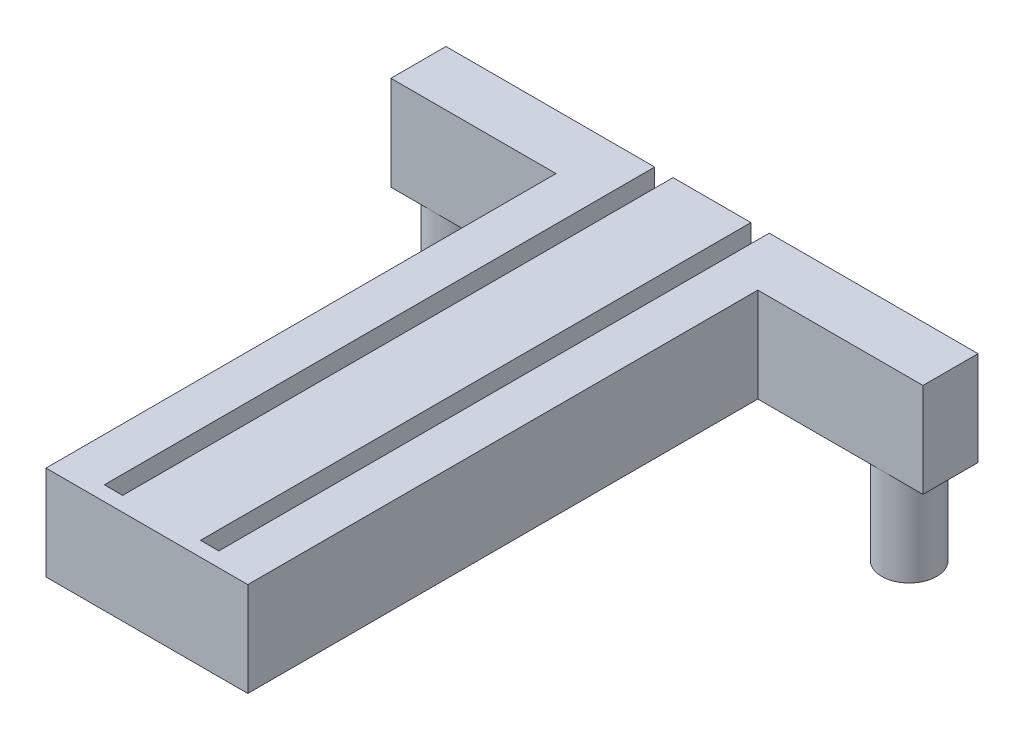
ISO-10303-21;
HEADER;
FILE_DESCRIPTION(('STEP AP214'),'2;1');
FILE_NAME('part.step','',(''),(''),'','','');
FILE_SCHEMA(('AUTOMOTIVE_DESIGN { 1 0 10303 214 1 1 1 1 }'));
ENDSEC;
DATA;
#1=APPLICATION_CONTEXT('core data for automotive mechanical design processes');
#2=APPLICATION_PROTOCOL_DEFINITION('international standard','automotive_design',2000,#1);
#3=PRODUCT_CONTEXT('',#1,'mechanical');
#4=PRODUCT('Part','Part','',(#3));
#5=PRODUCT_RELATED_PRODUCT_CATEGORY('part','',(#4));
#6=PRODUCT_DEFINITION_FORMATION('','',#4);
#7=PRODUCT_DEFINITION_CONTEXT('part definition',#1,'design');
#8=PRODUCT_DEFINITION('design','',#6,#7);
#9=PRODUCT_DEFINITION_SHAPE('','',#8);
#10=(LENGTH_UNIT() NAMED_UNIT(*) SI_UNIT(.MILLI.,.METRE.));
#11=(NAMED_UNIT(*) PLANE_ANGLE_UNIT() SI_UNIT($,.RADIAN.));
#12=(NAMED_UNIT(*) SI_UNIT($,.STERADIAN.) SOLID_ANGLE_UNIT());
#13=UNCERTAINTY_MEASURE_WITH_UNIT(LENGTH_MEASURE(1.E-05),#10,'distance_accuracy_value','');
#14=(GEOMETRIC_REPRESENTATION_CONTEXT(3) GLOBAL_UNCERTAINTY_ASSIGNED_CONTEXT((#13)) GLOBAL_UNIT_ASSIGNED_CONTEXT((#10,
#11,#12)) REPRESENTATION_CONTEXT('',''));
#15=CARTESIAN_POINT('',(0.,0.,0.));
#16=DIRECTION('',(0.,0.,1.));
#17=DIRECTION('',(1.,0.,0.));
#18=AXIS2_PLACEMENT_3D('',#15,#16,#17);
#19=CARTESIAN_POINT('',(31.75,-2.59150528660835,76.2));
#20=DIRECTION('',(0.,1.,0.));
#21=DIRECTION('',(0.,0.,1.));
#22=AXIS2_PLACEMENT_3D('',#19,#20,#21);
#23=PLANE('',#22);
#24=CARTESIAN_POINT('',(31.115,-2.59150528660835,3.81));
#25=DIRECTION('',(0.,-1.,0.));
#26=DIRECTION('',(0.,0.,-1.));
#27=AXIS2_PLACEMENT_3D('',#24,#25,#26);
#28=CIRCLE('',#27,3.81);
#29=CARTESIAN_POINT('',(31.115,-2.59150528660835,7.62));
#30=VERTEX_POINT('',#29);
#31=CARTESIAN_POINT('',(31.115,-2.59150528660835,0.));
#32=VERTEX_POINT('',#31);
#33=EDGE_CURVE('E609',#30,#32,#28,.T.);
#34=ORIENTED_EDGE('',*,*,#33,.F.);
#35=DIRECTION('',(-1.,0.,0.));
#36=VECTOR('',#35,1.);
#37=CARTESIAN_POINT('',(31.75,-2.59150528660835,7.62000000000002));
#38=LINE('',#37,#36);
#39=CARTESIAN_POINT('',(13.97,-2.59150528660837,7.62));
#40=VERTEX_POINT('',#39);
#41=EDGE_CURVE('E456',#30,#40,#38,.T.);
#42=ORIENTED_EDGE('',*,*,#41,.T.);
#43=DIRECTION('',(0.,0.,1.));
#44=VECTOR('',#43,1.);
#45=CARTESIAN_POINT('',(13.97,-2.59150528660835,76.2));
#46=LINE('',#45,#44);
#47=CARTESIAN_POINT('',(13.97,-2.59150528660837,78.232));
#48=VERTEX_POINT('',#47);
#49=EDGE_CURVE('E461',#40,#48,#46,.T.);
#50=ORIENTED_EDGE('',*,*,#49,.T.);
#51=DIRECTION('',(1.,0.,0.));
#52=VECTOR('',#51,1.);
#53=CARTESIAN_POINT('',(-13.97,-2.59150528660837,78.232));
#54=LINE('',#53,#52);
#55=CARTESIAN_POINT('',(-13.97,-2.59150528660837,78.232));
#56=VERTEX_POINT('',#55);
#57=EDGE_CURVE('E590',#56,#48,#54,.T.);
#58=ORIENTED_EDGE('',*,*,#57,.F.);
#59=DIRECTION('',(0.,0.,-1.));
#60=VECTOR('',#59,1.);
#61=CARTESIAN_POINT('',(-13.97,-2.59150528660835,76.2));
#62=LINE('',#61,#60);
#63=CARTESIAN_POINT('',(-13.97,-2.59150528660837,7.62));
#64=VERTEX_POINT('',#63);
#65=EDGE_CURVE('E457',#56,#64,#62,.T.);
#66=ORIENTED_EDGE('',*,*,#65,.T.);
#67=DIRECTION('',(-1.,0.,0.));
#68=VECTOR('',#67,1.);
#69=CARTESIAN_POINT('',(31.75,-2.59150528660835,7.62000000000002));
#70=LINE('',#69,#68);
#71=CARTESIAN_POINT('',(-31.115,-2.59150528660835,7.62000000000002));
#72=VERTEX_POINT('',#71);
#73=EDGE_CURVE('E287',#64,#72,#70,.T.);
#74=ORIENTED_EDGE('',*,*,#73,.T.);
#75=CARTESIAN_POINT('',(-31.115,-2.59150528660835,3.81));
#76=DIRECTION('',(0.,-1.,0.));
#77=DIRECTION('',(0.,0.,-1.));
#78=AXIS2_PLACEMENT_3D('',#75,#76,#77);
#79=CIRCLE('',#78,3.81);
#80=CARTESIAN_POINT('',(-31.115,-2.59150528660835,0.));
#81=VERTEX_POINT('',#80);
#82=EDGE_CURVE('E597',#81,#72,#79,.T.);
#83=ORIENTED_EDGE('',*,*,#82,.F.);
#84=DIRECTION('',(1.,0.,0.));
#85=VECTOR('',#84,1.);
#86=CARTESIAN_POINT('',(31.75,-2.59150528660835,0.));
#87=LINE('',#86,#85);
#88=CARTESIAN_POINT('',(0.,-2.59150528660837,0.));
#89=VERTEX_POINT('',#88);
#90=EDGE_CURVE('E386',#81,#89,#87,.T.);
#91=ORIENTED_EDGE('',*,*,#90,.T.);
#92=DIRECTION('',(0.,0.,1.));
#93=VECTOR('',#92,1.);
#94=CARTESIAN_POINT('',(0.,-2.59150528660837,-22.86));
#95=LINE('',#94,#93);
#96=CARTESIAN_POINT('',(0.,-2.59150528660837,76.962));
#97=VERTEX_POINT('',#96);
#98=EDGE_CURVE('E532',#89,#97,#95,.T.);
#99=ORIENTED_EDGE('',*,*,#98,.T.);
#100=DIRECTION('',(1.,0.,0.));
#101=VECTOR('',#100,1.);
#102=CARTESIAN_POINT('',(-13.97,-2.59150528660837,76.962));
#103=LINE('',#102,#101);
#104=CARTESIAN_POINT('',(1.32900114555891,-2.59150528660837,76.962));
#105=VERTEX_POINT('',#104);
#106=EDGE_CURVE('E577',#97,#105,#103,.T.);
#107=ORIENTED_EDGE('',*,*,#106,.T.);
#108=DIRECTION('',(0.,0.,1.));
#109=VECTOR('',#108,1.);
#110=CARTESIAN_POINT('',(1.32900114555892,-2.59150528660837,-22.86));
#111=LINE('',#110,#109);
#112=CARTESIAN_POINT('',(1.32900114555892,-2.59150528660837,0.));
#113=VERTEX_POINT('',#112);
#114=EDGE_CURVE('E533',#113,#105,#111,.T.);
#115=ORIENTED_EDGE('',*,*,#114,.F.);
#116=EDGE_CURVE('E388',#113,#32,#87,.T.);
#117=ORIENTED_EDGE('',*,*,#116,.T.);
#118=EDGE_LOOP('',(#34,#42,#50,#58,#66,#74,#83,#91,#99,#107,#115,#117));
#119=FACE_BOUND('',#118,.T.);
#120=ADVANCED_FACE('F40',(#119),#23,.F.);
#121=EDGE_CURVE('E605',#32,#30,#28,.T.);
#122=ORIENTED_EDGE('',*,*,#121,.F.);
#123=CARTESIAN_POINT('',(36.83,-2.59150528660835,0.));
#124=VERTEX_POINT('',#123);
#125=EDGE_CURVE('E387',#32,#124,#87,.T.);
#126=ORIENTED_EDGE('',*,*,#125,.T.);
#127=DIRECTION('',(0.,0.,-1.));
#128=VECTOR('',#127,1.);
#129=CARTESIAN_POINT('',(36.83,-2.59150528660835,76.2));
#130=LINE('',#129,#128);
#131=CARTESIAN_POINT('',(36.83,-2.59150528660837,7.62));
#132=VERTEX_POINT('',#131);
#133=EDGE_CURVE('E318',#132,#124,#130,.T.);
#134=ORIENTED_EDGE('',*,*,#133,.F.);
#135=EDGE_CURVE('E414',#132,#30,#38,.T.);
#136=ORIENTED_EDGE('',*,*,#135,.T.);
#137=EDGE_LOOP('',(#122,#126,#134,#136));
#138=FACE_BOUND('',#137,.T.);
#139=ADVANCED_FACE('F650',(#138),#23,.F.);
#140=CARTESIAN_POINT('',(1.79605122421383,1.79605122421383,76.2));
#141=DIRECTION('',(-1.,0.,0.));
#142=DIRECTION('',(0.,0.,1.));
#143=AXIS2_PLACEMENT_3D('',#140,#141,#142);
#144=PLANE('',#143);
#145=DIRECTION('',(0.,1.,0.));
#146=VECTOR('',#145,1.);
#147=CARTESIAN_POINT('',(1.79605122421383,1.79605122421383,76.2));
#148=LINE('',#147,#146);
#149=CARTESIAN_POINT('',(1.79605122421383,1.49263776173654,76.2));
#150=VERTEX_POINT('',#149);
#151=CARTESIAN_POINT('',(1.79605122421383,1.79605122421383,76.2));
#152=VERTEX_POINT('',#151);
#153=EDGE_CURVE('E426',#150,#152,#148,.T.);
#154=ORIENTED_EDGE('',*,*,#153,.F.);
#155=DIRECTION('',(0.,0.,-1.));
#156=VECTOR('',#155,1.);
#157=CARTESIAN_POINT('',(1.79605122421383,1.49263776173654,76.2));
#158=LINE('',#157,#156);
#159=CARTESIAN_POINT('',(1.79605122421383,1.49263776173654,0.));
#160=VERTEX_POINT('',#159);
#161=EDGE_CURVE('E504',#150,#160,#158,.T.);
#162=ORIENTED_EDGE('',*,*,#161,.T.);
#163=DIRECTION('',(0.,1.,0.));
#164=VECTOR('',#163,1.);
#165=CARTESIAN_POINT('',(1.79605122421383,1.79605122421383,0.));
#166=LINE('',#165,#164);
#167=CARTESIAN_POINT('',(1.79605122421383,1.79605122421383,0.));
#168=VERTEX_POINT('',#167);
#169=EDGE_CURVE('E368',#160,#168,#166,.T.);
#170=ORIENTED_EDGE('',*,*,#169,.T.);
#171=DIRECTION('',(0.,0.,-1.));
#172=VECTOR('',#171,1.);
#173=CARTESIAN_POINT('',(1.79605122421383,1.79605122421383,76.2));
#174=LINE('',#173,#172);
#175=EDGE_CURVE('E337',#152,#168,#174,.T.);
#176=ORIENTED_EDGE('',*,*,#175,.F.);
#177=EDGE_LOOP('',(#154,#162,#170,#176));
#178=FACE_BOUND('',#177,.T.);
#179=ADVANCED_FACE('F658',(#178),#144,.F.);
#180=CARTESIAN_POINT('',(0.,0.,0.));
#181=DIRECTION('',(0.,0.,1.));
#182=DIRECTION('',(1.,0.,0.));
#183=AXIS2_PLACEMENT_3D('',#180,#181,#182);
#184=PLANE('',#183);
#185=DIRECTION('',(-1.,0.,0.));
#186=VECTOR('',#185,1.);
#187=CARTESIAN_POINT('',(0.,1.49263776173654,0.));
#188=LINE('',#187,#186);
#189=CARTESIAN_POINT('',(0.,1.49263776173654,0.));
#190=VERTEX_POINT('',#189);
#191=EDGE_CURVE('E500',#160,#190,#188,.T.);
#192=ORIENTED_EDGE('',*,*,#191,.T.);
#193=DIRECTION('',(0.,-1.,0.));
#194=VECTOR('',#193,1.);
#195=CARTESIAN_POINT('',(0.,0.,0.));
#196=LINE('',#195,#194);
#197=EDGE_CURVE('E496',#190,#89,#196,.T.);
#198=ORIENTED_EDGE('',*,*,#197,.T.);
#199=ORIENTED_EDGE('',*,*,#90,.F.);
#200=CARTESIAN_POINT('',(-36.83,-2.59150528660835,0.));
#201=VERTEX_POINT('',#200);
#202=EDGE_CURVE('E383',#201,#81,#87,.T.);
#203=ORIENTED_EDGE('',*,*,#202,.F.);
#204=DIRECTION('',(0.,-1.,0.));
#205=VECTOR('',#204,1.);
#206=CARTESIAN_POINT('',(-36.83,10.4681536726415,0.));
#207=LINE('',#206,#205);
#208=CARTESIAN_POINT('',(-36.83,10.4681536726415,0.));
#209=VERTEX_POINT('',#208);
#210=EDGE_CURVE('E389',#209,#201,#207,.T.);
#211=ORIENTED_EDGE('',*,*,#210,.F.);
#212=DIRECTION('',(-1.,0.,0.));
#213=VECTOR('',#212,1.);
#214=CARTESIAN_POINT('',(-31.75,10.4681536726415,0.));
#215=LINE('',#214,#213);
#216=CARTESIAN_POINT('',(-7.92815367264149,10.4681536726415,0.));
#217=VERTEX_POINT('',#216);
#218=EDGE_CURVE('E393',#217,#209,#215,.T.);
#219=ORIENTED_EDGE('',*,*,#218,.F.);
#220=DIRECTION('',(0.,1.,0.));
#221=VECTOR('',#220,1.);
#222=CARTESIAN_POINT('',(-7.92815367264149,10.4681536726415,0.));
#223=LINE('',#222,#221);
#224=CARTESIAN_POINT('',(-7.92815367264149,0.,0.));
#225=VERTEX_POINT('',#224);
#226=EDGE_CURVE('E397',#225,#217,#223,.T.);
#227=ORIENTED_EDGE('',*,*,#226,.F.);
#228=DIRECTION('',(-1.,0.,0.));
#229=VECTOR('',#228,1.);
#230=CARTESIAN_POINT('',(-7.92815367264149,0.,0.));
#231=LINE('',#230,#229);
#232=CARTESIAN_POINT('',(-1.79605122421383,0.,0.));
#233=VERTEX_POINT('',#232);
#234=EDGE_CURVE('E401',#233,#225,#231,.T.);
#235=ORIENTED_EDGE('',*,*,#234,.F.);
#236=DIRECTION('',(0.,-1.,0.));
#237=VECTOR('',#236,1.);
#238=CARTESIAN_POINT('',(-1.79605122421383,1.79605122421383,0.));
#239=LINE('',#238,#237);
#240=CARTESIAN_POINT('',(-1.79605122421383,1.79605122421383,0.));
#241=VERTEX_POINT('',#240);
#242=EDGE_CURVE('E404',#241,#233,#239,.T.);
#243=ORIENTED_EDGE('',*,*,#242,.F.);
#244=DIRECTION('',(0.707106781186553,-0.707106781186542,0.));
#245=VECTOR('',#244,1.);
#246=CARTESIAN_POINT('',(-1.79605122421383,1.79605122421383,0.));
#247=LINE('',#246,#245);
#248=CARTESIAN_POINT('',(-5.38815367264152,5.38815367264147,0.));
#249=VERTEX_POINT('',#248);
#250=EDGE_CURVE('E407',#249,#241,#247,.T.);
#251=ORIENTED_EDGE('',*,*,#250,.F.);
#252=DIRECTION('',(0.,-1.,0.));
#253=VECTOR('',#252,1.);
#254=CARTESIAN_POINT('',(-5.38815367264152,5.38815367264147,0.));
#255=LINE('',#254,#253);
#256=CARTESIAN_POINT('',(-5.38815367264149,10.4681536726415,0.));
#257=VERTEX_POINT('',#256);
#258=EDGE_CURVE('E410',#257,#249,#255,.T.);
#259=ORIENTED_EDGE('',*,*,#258,.F.);
#260=DIRECTION('',(-1.,0.,0.));
#261=VECTOR('',#260,1.);
#262=CARTESIAN_POINT('',(5.38815367264141,10.4681536726415,0.));
#263=LINE('',#262,#261);
#264=CARTESIAN_POINT('',(5.38815367264141,10.4681536726415,0.));
#265=VERTEX_POINT('',#264);
#266=EDGE_CURVE('E354',#265,#257,#263,.T.);
#267=ORIENTED_EDGE('',*,*,#266,.F.);
#268=DIRECTION('',(0.,1.,0.));
#269=VECTOR('',#268,1.);
#270=CARTESIAN_POINT('',(5.38815367264141,5.38815367264147,0.));
#271=LINE('',#270,#269);
#272=CARTESIAN_POINT('',(5.38815367264141,5.38815367264147,0.));
#273=VERTEX_POINT('',#272);
#274=EDGE_CURVE('E358',#273,#265,#271,.T.);
#275=ORIENTED_EDGE('',*,*,#274,.F.);
#276=DIRECTION('',(0.707106781186542,0.707106781186553,0.));
#277=VECTOR('',#276,1.);
#278=CARTESIAN_POINT('',(1.79605122421383,1.79605122421383,0.));
#279=LINE('',#278,#277);
#280=EDGE_CURVE('E361',#168,#273,#279,.T.);
#281=ORIENTED_EDGE('',*,*,#280,.F.);
#282=ORIENTED_EDGE('',*,*,#169,.F.);
#283=EDGE_LOOP('',(#192,#198,#199,#203,#211,#219,#227,#235,#243,#251,#259,#267,#275,#281,#282));
#284=FACE_BOUND('',#283,.T.);
#285=ADVANCED_FACE('F754',(#284),#184,.F.);
#286=CARTESIAN_POINT('',(-5.38815367264152,5.38815367264147,76.2));
#287=DIRECTION('',(1.,0.,0.));
#288=DIRECTION('',(0.,1.,0.));
#289=AXIS2_PLACEMENT_3D('',#286,#287,#288);
#290=PLANE('',#289);
#291=ORIENTED_EDGE('',*,*,#258,.T.);
#292=DIRECTION('',(0.,0.,-1.));
#293=VECTOR('',#292,1.);
#294=CARTESIAN_POINT('',(-5.38815367264152,5.38815367264147,76.2));
#295=LINE('',#294,#293);
#296=CARTESIAN_POINT('',(-5.38815367264152,5.38815367264147,76.2));
#297=VERTEX_POINT('',#296);
#298=EDGE_CURVE('E292',#297,#249,#295,.T.);
#299=ORIENTED_EDGE('',*,*,#298,.F.);
#300=DIRECTION('',(0.,-1.,0.));
#301=VECTOR('',#300,1.);
#302=CARTESIAN_POINT('',(-5.38815367264152,5.38815367264147,76.2));
#303=LINE('',#302,#301);
#304=CARTESIAN_POINT('',(-5.38815367264149,10.4681536726415,76.2));
#305=VERTEX_POINT('',#304);
#306=EDGE_CURVE('E357',#305,#297,#303,.T.);
#307=ORIENTED_EDGE('',*,*,#306,.F.);
#308=DIRECTION('',(0.,0.,-1.));
#309=VECTOR('',#308,1.);
#310=CARTESIAN_POINT('',(-5.38815367264149,10.4681536726415,76.2));
#311=LINE('',#310,#309);
#312=EDGE_CURVE('E349',#305,#257,#311,.T.);
#313=ORIENTED_EDGE('',*,*,#312,.T.);
#314=EDGE_LOOP('',(#291,#299,#307,#313));
#315=FACE_BOUND('',#314,.T.);
#316=ADVANCED_FACE('F42',(#315),#290,.F.);
#317=CARTESIAN_POINT('',(-1.79605122421383,1.79605122421383,76.2));
#318=DIRECTION('',(0.707106781186542,0.707106781186553,0.));
#319=DIRECTION('',(-0.707106781186553,0.707106781186542,0.));
#320=AXIS2_PLACEMENT_3D('',#317,#318,#319);
#321=PLANE('',#320);
#322=ORIENTED_EDGE('',*,*,#250,.T.);
#323=DIRECTION('',(0.,0.,-1.));
#324=VECTOR('',#323,1.);
#325=CARTESIAN_POINT('',(-1.79605122421383,1.79605122421383,76.2));
#326=LINE('',#325,#324);
#327=CARTESIAN_POINT('',(-1.79605122421383,1.79605122421383,76.2));
#328=VERTEX_POINT('',#327);
#329=EDGE_CURVE('E296',#328,#241,#326,.T.);
#330=ORIENTED_EDGE('',*,*,#329,.F.);
#331=DIRECTION('',(0.707106781186553,-0.707106781186542,0.));
#332=VECTOR('',#331,1.);
#333=CARTESIAN_POINT('',(-1.79605122421383,1.79605122421383,76.2));
#334=LINE('',#333,#332);
#335=EDGE_CURVE('E447',#297,#328,#334,.T.);
#336=ORIENTED_EDGE('',*,*,#335,.F.);
#337=ORIENTED_EDGE('',*,*,#298,.T.);
#338=EDGE_LOOP('',(#322,#330,#336,#337));
#339=FACE_BOUND('',#338,.T.);
#340=ADVANCED_FACE('F838',(#339),#321,.F.);
#341=CARTESIAN_POINT('',(-1.79605122421383,1.79605122421383,76.2));
#342=DIRECTION('',(1.,0.,0.));
#343=DIRECTION('',(0.,1.,0.));
#344=AXIS2_PLACEMENT_3D('',#341,#342,#343);
#345=PLANE('',#344);
#346=ORIENTED_EDGE('',*,*,#242,.T.);
#347=DIRECTION('',(0.,0.,-1.));
#348=VECTOR('',#347,1.);
#349=CARTESIAN_POINT('',(-1.79605122421383,0.,76.2));
#350=LINE('',#349,#348);
#351=CARTESIAN_POINT('',(-1.79605122421383,0.,76.2));
#352=VERTEX_POINT('',#351);
#353=EDGE_CURVE('E300',#352,#233,#350,.T.);
#354=ORIENTED_EDGE('',*,*,#353,.F.);
#355=DIRECTION('',(0.,-1.,0.));
#356=VECTOR('',#355,1.);
#357=CARTESIAN_POINT('',(-1.79605122421383,1.79605122421383,76.2));
#358=LINE('',#357,#356);
#359=EDGE_CURVE('E443',#328,#352,#358,.T.);
#360=ORIENTED_EDGE('',*,*,#359,.F.);
#361=ORIENTED_EDGE('',*,*,#329,.T.);
#362=EDGE_LOOP('',(#346,#354,#360,#361));
#363=FACE_BOUND('',#362,.T.);
#364=ADVANCED_FACE('F847',(#363),#345,.F.);
#365=CARTESIAN_POINT('',(-7.92815367264149,0.,76.2));
#366=DIRECTION('',(0.,-1.,0.));
#367=DIRECTION('',(0.,0.,-1.));
#368=AXIS2_PLACEMENT_3D('',#365,#366,#367);
#369=PLANE('',#368);
#370=ORIENTED_EDGE('',*,*,#234,.T.);
#371=DIRECTION('',(0.,0.,-1.));
#372=VECTOR('',#371,1.);
#373=CARTESIAN_POINT('',(-7.92815367264149,0.,76.2));
#374=LINE('',#373,#372);
#375=CARTESIAN_POINT('',(-7.92815367264149,0.,76.2));
#376=VERTEX_POINT('',#375);
#377=EDGE_CURVE('E304',#376,#225,#374,.T.);
#378=ORIENTED_EDGE('',*,*,#377,.F.);
#379=DIRECTION('',(-1.,0.,0.));
#380=VECTOR('',#379,1.);
#381=CARTESIAN_POINT('',(-7.92815367264149,0.,76.2));
#382=LINE('',#381,#380);
#383=EDGE_CURVE('E439',#352,#376,#382,.T.);
#384=ORIENTED_EDGE('',*,*,#383,.F.);
#385=ORIENTED_EDGE('',*,*,#353,.T.);
#386=EDGE_LOOP('',(#370,#378,#384,#385));
#387=FACE_BOUND('',#386,.T.);
#388=ADVANCED_FACE('F844',(#387),#369,.F.);
#389=CARTESIAN_POINT('',(-7.92815367264149,10.4681536726415,76.2));
#390=DIRECTION('',(-1.,0.,0.));
#391=DIRECTION('',(0.,0.,1.));
#392=AXIS2_PLACEMENT_3D('',#389,#390,#391);
#393=PLANE('',#392);
#394=ORIENTED_EDGE('',*,*,#226,.T.);
#395=DIRECTION('',(0.,0.,-1.));
#396=VECTOR('',#395,1.);
#397=CARTESIAN_POINT('',(-7.92815367264149,10.4681536726415,76.2));
#398=LINE('',#397,#396);
#399=CARTESIAN_POINT('',(-7.92815367264149,10.4681536726415,76.2));
#400=VERTEX_POINT('',#399);
#401=EDGE_CURVE('E308',#400,#217,#398,.T.);
#402=ORIENTED_EDGE('',*,*,#401,.F.);
#403=DIRECTION('',(0.,1.,0.));
#404=VECTOR('',#403,1.);
#405=CARTESIAN_POINT('',(-7.92815367264149,10.4681536726415,76.2));
#406=LINE('',#405,#404);
#407=EDGE_CURVE('E435',#376,#400,#406,.T.);
#408=ORIENTED_EDGE('',*,*,#407,.F.);
#409=ORIENTED_EDGE('',*,*,#377,.T.);
#410=EDGE_LOOP('',(#394,#402,#408,#409));
#411=FACE_BOUND('',#410,.T.);
#412=ADVANCED_FACE('F674',(#411),#393,.F.);
#413=CARTESIAN_POINT('',(-36.83,10.4681536726415,76.2));
#414=DIRECTION('',(1.,0.,0.));
#415=DIRECTION('',(0.,0.,-1.));
#416=AXIS2_PLACEMENT_3D('',#413,#414,#415);
#417=PLANE('',#416);
#418=DIRECTION('',(0.,0.,-1.));
#419=VECTOR('',#418,1.);
#420=CARTESIAN_POINT('',(-36.83,-2.59150528660835,76.2));
#421=LINE('',#420,#419);
#422=CARTESIAN_POINT('',(-36.83,-2.59150528660837,7.62));
#423=VERTEX_POINT('',#422);
#424=EDGE_CURVE('E315',#423,#201,#421,.T.);
#425=ORIENTED_EDGE('',*,*,#424,.F.);
#426=DIRECTION('',(0.,1.,0.));
#427=VECTOR('',#426,1.);
#428=CARTESIAN_POINT('',(-36.83,-65.7318463273585,7.62));
#429=LINE('',#428,#427);
#430=CARTESIAN_POINT('',(-36.83,10.4681536726415,7.62));
#431=VERTEX_POINT('',#430);
#432=EDGE_CURVE('E464',#423,#431,#429,.T.);
#433=ORIENTED_EDGE('',*,*,#432,.T.);
#434=DIRECTION('',(0.,0.,-1.));
#435=VECTOR('',#434,1.);
#436=CARTESIAN_POINT('',(-36.83,10.4681536726415,76.2));
#437=LINE('',#436,#435);
#438=EDGE_CURVE('E312',#431,#209,#437,.T.);
#439=ORIENTED_EDGE('',*,*,#438,.T.);
#440=ORIENTED_EDGE('',*,*,#210,.T.);
#441=EDGE_LOOP('',(#425,#433,#439,#440));
#442=FACE_BOUND('',#441,.T.);
#443=ADVANCED_FACE('F665',(#442),#417,.F.);
#444=EDGE_CURVE('E286',#72,#81,#79,.T.);
#445=ORIENTED_EDGE('',*,*,#444,.F.);
#446=EDGE_CURVE('E291',#72,#423,#70,.T.);
#447=ORIENTED_EDGE('',*,*,#446,.T.);
#448=ORIENTED_EDGE('',*,*,#424,.T.);
#449=ORIENTED_EDGE('',*,*,#202,.T.);
#450=EDGE_LOOP('',(#445,#447,#448,#449));
#451=FACE_BOUND('',#450,.T.);
#452=ADVANCED_FACE('F653',(#451),#23,.F.);
#453=CARTESIAN_POINT('',(36.83,-2.59150528660835,76.2));
#454=DIRECTION('',(-1.,0.,0.));
#455=DIRECTION('',(0.,0.,1.));
#456=AXIS2_PLACEMENT_3D('',#453,#454,#455);
#457=PLANE('',#456);
#458=DIRECTION('',(0.,0.,-1.));
#459=VECTOR('',#458,1.);
#460=CARTESIAN_POINT('',(36.83,10.4681536726415,76.2));
#461=LINE('',#460,#459);
#462=CARTESIAN_POINT('',(36.83,10.4681536726415,7.62));
#463=VERTEX_POINT('',#462);
#464=CARTESIAN_POINT('',(36.83,10.4681536726415,0.));
#465=VERTEX_POINT('',#464);
#466=EDGE_CURVE('E322',#463,#465,#461,.T.);
#467=ORIENTED_EDGE('',*,*,#466,.F.);
#468=DIRECTION('',(0.,1.,0.));
#469=VECTOR('',#468,1.);
#470=CARTESIAN_POINT('',(36.83,-65.7318463273585,7.62));
#471=LINE('',#470,#469);
#472=EDGE_CURVE('E465',#132,#463,#471,.T.);
#473=ORIENTED_EDGE('',*,*,#472,.F.);
#474=ORIENTED_EDGE('',*,*,#133,.T.);
#475=DIRECTION('',(0.,1.,0.));
#476=VECTOR('',#475,1.);
#477=CARTESIAN_POINT('',(36.83,-2.59150528660835,0.));
#478=LINE('',#477,#476);
#479=EDGE_CURVE('E379',#124,#465,#478,.T.);
#480=ORIENTED_EDGE('',*,*,#479,.T.);
#481=EDGE_LOOP('',(#467,#473,#474,#480));
#482=FACE_BOUND('',#481,.T.);
#483=ADVANCED_FACE('F664',(#482),#457,.F.);
#484=CARTESIAN_POINT('',(7.92815367264141,0.,76.2));
#485=DIRECTION('',(1.,0.,0.));
#486=DIRECTION('',(0.,0.,-1.));
#487=AXIS2_PLACEMENT_3D('',#484,#485,#486);
#488=PLANE('',#487);
#489=DIRECTION('',(0.,-1.,0.));
#490=VECTOR('',#489,1.);
#491=CARTESIAN_POINT('',(7.92815367264141,0.,0.));
#492=LINE('',#491,#490);
#493=CARTESIAN_POINT('',(7.92815367264141,10.4681536726415,0.));
#494=VERTEX_POINT('',#493);
#495=CARTESIAN_POINT('',(7.92815367264141,0.,0.));
#496=VERTEX_POINT('',#495);
#497=EDGE_CURVE('E372',#494,#496,#492,.T.);
#498=ORIENTED_EDGE('',*,*,#497,.T.);
#499=DIRECTION('',(0.,0.,-1.));
#500=VECTOR('',#499,1.);
#501=CARTESIAN_POINT('',(7.92815367264141,0.,76.2));
#502=LINE('',#501,#500);
#503=CARTESIAN_POINT('',(7.92815367264141,0.,76.2));
#504=VERTEX_POINT('',#503);
#505=EDGE_CURVE('E329',#504,#496,#502,.T.);
#506=ORIENTED_EDGE('',*,*,#505,.F.);
#507=DIRECTION('',(0.,-1.,0.));
#508=VECTOR('',#507,1.);
#509=CARTESIAN_POINT('',(7.92815367264141,0.,76.2));
#510=LINE('',#509,#508);
#511=CARTESIAN_POINT('',(7.92815367264141,10.4681536726415,76.2));
#512=VERTEX_POINT('',#511);
#513=EDGE_CURVE('E431',#512,#504,#510,.T.);
#514=ORIENTED_EDGE('',*,*,#513,.F.);
#515=DIRECTION('',(0.,0.,-1.));
#516=VECTOR('',#515,1.);
#517=CARTESIAN_POINT('',(7.92815367264141,10.4681536726415,76.2));
#518=LINE('',#517,#516);
#519=EDGE_CURVE('E325',#512,#494,#518,.T.);
#520=ORIENTED_EDGE('',*,*,#519,.T.);
#521=EDGE_LOOP('',(#498,#506,#514,#520));
#522=FACE_BOUND('',#521,.T.);
#523=ADVANCED_FACE('F671',(#522),#488,.F.);
#524=CARTESIAN_POINT('',(1.79605122421383,0.,76.2));
#525=DIRECTION('',(0.,-1.,0.));
#526=DIRECTION('',(0.,0.,-1.));
#527=AXIS2_PLACEMENT_3D('',#524,#525,#526);
#528=PLANE('',#527);
#529=DIRECTION('',(-1.,0.,0.));
#530=VECTOR('',#529,1.);
#531=CARTESIAN_POINT('',(1.79605122421383,0.,0.));
#532=LINE('',#531,#530);
#533=CARTESIAN_POINT('',(1.79605122421383,0.,0.));
#534=VERTEX_POINT('',#533);
#535=EDGE_CURVE('E369',#496,#534,#532,.T.);
#536=ORIENTED_EDGE('',*,*,#535,.T.);
#537=DIRECTION('',(0.,0.,-1.));
#538=VECTOR('',#537,1.);
#539=CARTESIAN_POINT('',(1.79605122421383,0.,76.2));
#540=LINE('',#539,#538);
#541=CARTESIAN_POINT('',(1.79605122421383,0.,76.2));
#542=VERTEX_POINT('',#541);
#543=EDGE_CURVE('E333',#542,#534,#540,.T.);
#544=ORIENTED_EDGE('',*,*,#543,.F.);
#545=DIRECTION('',(-1.,0.,0.));
#546=VECTOR('',#545,1.);
#547=CARTESIAN_POINT('',(5.38815367264141,0.,76.2));
#548=LINE('',#547,#546);
#549=EDGE_CURVE('E427',#504,#542,#548,.T.);
#550=ORIENTED_EDGE('',*,*,#549,.F.);
#551=ORIENTED_EDGE('',*,*,#505,.T.);
#552=EDGE_LOOP('',(#536,#544,#550,#551));
#553=FACE_BOUND('',#552,.T.);
#554=ADVANCED_FACE('F768',(#553),#528,.F.);
#555=CARTESIAN_POINT('',(1.79605122421383,0.714117771054303,0.));
#556=VERTEX_POINT('',#555);
#557=EDGE_CURVE('E364',#534,#556,#166,.T.);
#558=ORIENTED_EDGE('',*,*,#557,.T.);
#559=DIRECTION('',(0.,0.,1.));
#560=VECTOR('',#559,1.);
#561=CARTESIAN_POINT('',(1.79605122421383,0.714117771054303,76.2));
#562=LINE('',#561,#560);
#563=CARTESIAN_POINT('',(1.79605122421383,0.714117771054303,76.2));
#564=VERTEX_POINT('',#563);
#565=EDGE_CURVE('E520',#556,#564,#562,.T.);
#566=ORIENTED_EDGE('',*,*,#565,.T.);
#567=EDGE_CURVE('E422',#542,#564,#148,.T.);
#568=ORIENTED_EDGE('',*,*,#567,.F.);
#569=ORIENTED_EDGE('',*,*,#543,.T.);
#570=EDGE_LOOP('',(#558,#566,#568,#569));
#571=FACE_BOUND('',#570,.T.);
#572=ADVANCED_FACE('F764',(#571),#144,.F.);
#573=CARTESIAN_POINT('',(1.79605122421383,1.79605122421383,76.2));
#574=DIRECTION('',(-0.707106781186553,0.707106781186542,0.));
#575=DIRECTION('',(-0.707106781186542,-0.707106781186553,0.));
#576=AXIS2_PLACEMENT_3D('',#573,#574,#575);
#577=PLANE('',#576);
#578=ORIENTED_EDGE('',*,*,#280,.T.);
#579=DIRECTION('',(0.,0.,-1.));
#580=VECTOR('',#579,1.);
#581=CARTESIAN_POINT('',(5.38815367264141,5.38815367264147,76.2));
#582=LINE('',#581,#580);
#583=CARTESIAN_POINT('',(5.38815367264141,5.38815367264147,76.2));
#584=VERTEX_POINT('',#583);
#585=EDGE_CURVE('E341',#584,#273,#582,.T.);
#586=ORIENTED_EDGE('',*,*,#585,.F.);
#587=DIRECTION('',(0.707106781186542,0.707106781186553,0.));
#588=VECTOR('',#587,1.);
#589=CARTESIAN_POINT('',(1.79605122421383,1.79605122421383,76.2));
#590=LINE('',#589,#588);
#591=EDGE_CURVE('E418',#152,#584,#590,.T.);
#592=ORIENTED_EDGE('',*,*,#591,.F.);
#593=ORIENTED_EDGE('',*,*,#175,.T.);
#594=EDGE_LOOP('',(#578,#586,#592,#593));
#595=FACE_BOUND('',#594,.T.);
#596=ADVANCED_FACE('F760',(#595),#577,.F.);
#597=CARTESIAN_POINT('',(5.38815367264141,5.38815367264147,76.2));
#598=DIRECTION('',(-1.,0.,0.));
#599=DIRECTION('',(0.,0.,1.));
#600=AXIS2_PLACEMENT_3D('',#597,#598,#599);
#601=PLANE('',#600);
#602=ORIENTED_EDGE('',*,*,#274,.T.);
#603=DIRECTION('',(0.,0.,-1.));
#604=VECTOR('',#603,1.);
#605=CARTESIAN_POINT('',(5.38815367264141,10.4681536726415,76.2));
#606=LINE('',#605,#604);
#607=CARTESIAN_POINT('',(5.38815367264141,10.4681536726415,76.2));
#608=VERTEX_POINT('',#607);
#609=EDGE_CURVE('E345',#608,#265,#606,.T.);
#610=ORIENTED_EDGE('',*,*,#609,.F.);
#611=DIRECTION('',(0.,1.,0.));
#612=VECTOR('',#611,1.);
#613=CARTESIAN_POINT('',(5.38815367264141,5.38815367264147,76.2));
#614=LINE('',#613,#612);
#615=EDGE_CURVE('E353',#584,#608,#614,.T.);
#616=ORIENTED_EDGE('',*,*,#615,.F.);
#617=ORIENTED_EDGE('',*,*,#585,.T.);
#618=EDGE_LOOP('',(#602,#610,#616,#617));
#619=FACE_BOUND('',#618,.T.);
#620=ADVANCED_FACE('F756',(#619),#601,.F.);
#621=CARTESIAN_POINT('',(5.38815367264141,10.4681536726415,76.2));
#622=DIRECTION('',(0.,-1.,0.));
#623=DIRECTION('',(0.,0.,-1.));
#624=AXIS2_PLACEMENT_3D('',#621,#622,#623);
#625=PLANE('',#624);
#626=ORIENTED_EDGE('',*,*,#266,.T.);
#627=ORIENTED_EDGE('',*,*,#312,.F.);
#628=DIRECTION('',(-1.,0.,0.));
#629=VECTOR('',#628,1.);
#630=CARTESIAN_POINT('',(-13.97,10.4681536726415,76.2));
#631=LINE('',#630,#629);
#632=EDGE_CURVE('E492',#305,#400,#631,.T.);
#633=ORIENTED_EDGE('',*,*,#632,.T.);
#634=ORIENTED_EDGE('',*,*,#401,.T.);
#635=ORIENTED_EDGE('',*,*,#218,.T.);
#636=ORIENTED_EDGE('',*,*,#438,.F.);
#637=DIRECTION('',(-1.,0.,0.));
#638=VECTOR('',#637,1.);
#639=CARTESIAN_POINT('',(-36.83,10.4681536726415,7.62));
#640=LINE('',#639,#638);
#641=CARTESIAN_POINT('',(-13.97,10.4681536726415,7.62));
#642=VERTEX_POINT('',#641);
#643=EDGE_CURVE('E483',#642,#431,#640,.T.);
#644=ORIENTED_EDGE('',*,*,#643,.F.);
#645=DIRECTION('',(0.,0.,-1.));
#646=VECTOR('',#645,1.);
#647=CARTESIAN_POINT('',(-13.97,10.4681536726415,76.2));
#648=LINE('',#647,#646);
#649=CARTESIAN_POINT('',(-13.97,10.4681536726415,78.232));
#650=VERTEX_POINT('',#649);
#651=EDGE_CURVE('E472',#650,#642,#648,.T.);
#652=ORIENTED_EDGE('',*,*,#651,.F.);
#653=DIRECTION('',(-1.,0.,0.));
#654=VECTOR('',#653,1.);
#655=CARTESIAN_POINT('',(-13.97,10.4681536726415,78.232));
#656=LINE('',#655,#654);
#657=CARTESIAN_POINT('',(13.97,10.4681536726415,78.232));
#658=VERTEX_POINT('',#657);
#659=EDGE_CURVE('E576',#658,#650,#656,.T.);
#660=ORIENTED_EDGE('',*,*,#659,.F.);
#661=DIRECTION('',(0.,0.,1.));
#662=VECTOR('',#661,1.);
#663=CARTESIAN_POINT('',(13.97,10.4681536726415,76.2));
#664=LINE('',#663,#662);
#665=CARTESIAN_POINT('',(13.97,10.4681536726415,7.62));
#666=VERTEX_POINT('',#665);
#667=EDGE_CURVE('E469',#666,#658,#664,.T.);
#668=ORIENTED_EDGE('',*,*,#667,.F.);
#669=DIRECTION('',(-1.,0.,0.));
#670=VECTOR('',#669,1.);
#671=CARTESIAN_POINT('',(36.83,10.4681536726415,7.62));
#672=LINE('',#671,#670);
#673=EDGE_CURVE('E475',#463,#666,#672,.T.);
#674=ORIENTED_EDGE('',*,*,#673,.F.);
#675=ORIENTED_EDGE('',*,*,#466,.T.);
#676=DIRECTION('',(-1.,0.,0.));
#677=VECTOR('',#676,1.);
#678=CARTESIAN_POINT('',(7.92815367264141,10.4681536726415,0.));
#679=LINE('',#678,#677);
#680=EDGE_CURVE('E376',#465,#494,#679,.T.);
#681=ORIENTED_EDGE('',*,*,#680,.T.);
#682=ORIENTED_EDGE('',*,*,#519,.F.);
#683=EDGE_CURVE('E479',#512,#608,#631,.T.);
#684=ORIENTED_EDGE('',*,*,#683,.T.);
#685=ORIENTED_EDGE('',*,*,#609,.T.);
#686=EDGE_LOOP('',(#626,#627,#633,#634,#635,#636,#644,#652,#660,#668,#674,#675,#681,#682,#684,#685));
#687=FACE_BOUND('',#686,.T.);
#688=ADVANCED_FACE('F752',(#687),#625,.F.);
#689=DIRECTION('',(0.,1.,0.));
#690=VECTOR('',#689,1.);
#691=CARTESIAN_POINT('',(1.32900114555892,0.,0.));
#692=LINE('',#691,#690);
#693=CARTESIAN_POINT('',(1.32900114555892,0.714117771054303,0.));
#694=VERTEX_POINT('',#693);
#695=EDGE_CURVE('E528',#113,#694,#692,.T.);
#696=ORIENTED_EDGE('',*,*,#695,.T.);
#697=DIRECTION('',(1.,0.,0.));
#698=VECTOR('',#697,1.);
#699=CARTESIAN_POINT('',(0.,0.714117771054303,0.));
#700=LINE('',#699,#698);
#701=EDGE_CURVE('E516',#694,#556,#700,.T.);
#702=ORIENTED_EDGE('',*,*,#701,.T.);
#703=ORIENTED_EDGE('',*,*,#557,.F.);
#704=ORIENTED_EDGE('',*,*,#535,.F.);
#705=ORIENTED_EDGE('',*,*,#497,.F.);
#706=ORIENTED_EDGE('',*,*,#680,.F.);
#707=ORIENTED_EDGE('',*,*,#479,.F.);
#708=ORIENTED_EDGE('',*,*,#125,.F.);
#709=ORIENTED_EDGE('',*,*,#116,.F.);
#710=EDGE_LOOP('',(#696,#702,#703,#704,#705,#706,#707,#708,#709));
#711=FACE_BOUND('',#710,.T.);
#712=ADVANCED_FACE('F748',(#711),#184,.F.);
#713=CARTESIAN_POINT('',(36.83,-65.7318463273585,7.62));
#714=DIRECTION('',(0.,0.,-1.));
#715=DIRECTION('',(-1.,0.,0.));
#716=AXIS2_PLACEMENT_3D('',#713,#714,#715);
#717=PLANE('',#716);
#718=ORIENTED_EDGE('',*,*,#472,.T.);
#719=ORIENTED_EDGE('',*,*,#673,.T.);
#720=DIRECTION('',(0.,1.,0.));
#721=VECTOR('',#720,1.);
#722=CARTESIAN_POINT('',(13.97,-65.7318463273585,7.62));
#723=LINE('',#722,#721);
#724=EDGE_CURVE('E468',#40,#666,#723,.T.);
#725=ORIENTED_EDGE('',*,*,#724,.F.);
#726=ORIENTED_EDGE('',*,*,#41,.F.);
#727=ORIENTED_EDGE('',*,*,#135,.F.);
#728=EDGE_LOOP('',(#718,#719,#725,#726,#727));
#729=FACE_BOUND('',#728,.T.);
#730=ADVANCED_FACE('F744',(#729),#717,.F.);
#731=CARTESIAN_POINT('',(13.97,-65.7318463273585,76.2));
#732=DIRECTION('',(-1.,0.,0.));
#733=DIRECTION('',(0.,0.,1.));
#734=AXIS2_PLACEMENT_3D('',#731,#732,#733);
#735=PLANE('',#734);
#736=ORIENTED_EDGE('',*,*,#724,.T.);
#737=ORIENTED_EDGE('',*,*,#667,.T.);
#738=DIRECTION('',(0.,1.,0.));
#739=VECTOR('',#738,1.);
#740=CARTESIAN_POINT('',(13.97,10.4681536726415,78.232));
#741=LINE('',#740,#739);
#742=EDGE_CURVE('E586',#48,#658,#741,.T.);
#743=ORIENTED_EDGE('',*,*,#742,.F.);
#744=ORIENTED_EDGE('',*,*,#49,.F.);
#745=EDGE_LOOP('',(#736,#737,#743,#744));
#746=FACE_BOUND('',#745,.T.);
#747=ADVANCED_FACE('F738',(#746),#735,.F.);
#748=CARTESIAN_POINT('',(-36.83,-65.7318463273585,7.62));
#749=DIRECTION('',(0.,0.,-1.));
#750=DIRECTION('',(-1.,0.,0.));
#751=AXIS2_PLACEMENT_3D('',#748,#749,#750);
#752=PLANE('',#751);
#753=DIRECTION('',(0.,1.,0.));
#754=VECTOR('',#753,1.);
#755=CARTESIAN_POINT('',(-13.97,-65.7318463273585,7.62));
#756=LINE('',#755,#754);
#757=EDGE_CURVE('E480',#64,#642,#756,.T.);
#758=ORIENTED_EDGE('',*,*,#757,.T.);
#759=ORIENTED_EDGE('',*,*,#643,.T.);
#760=ORIENTED_EDGE('',*,*,#432,.F.);
#761=ORIENTED_EDGE('',*,*,#446,.F.);
#762=ORIENTED_EDGE('',*,*,#73,.F.);
#763=EDGE_LOOP('',(#758,#759,#760,#761,#762));
#764=FACE_BOUND('',#763,.T.);
#765=ADVANCED_FACE('F684',(#764),#752,.F.);
#766=CARTESIAN_POINT('',(-13.97,-65.7318463273585,76.2));
#767=DIRECTION('',(1.,0.,0.));
#768=DIRECTION('',(0.,0.,-1.));
#769=AXIS2_PLACEMENT_3D('',#766,#767,#768);
#770=PLANE('',#769);
#771=ORIENTED_EDGE('',*,*,#65,.F.);
#772=DIRECTION('',(0.,-1.,0.));
#773=VECTOR('',#772,1.);
#774=CARTESIAN_POINT('',(-13.97,10.4681536726415,78.232));
#775=LINE('',#774,#773);
#776=EDGE_CURVE('E581',#650,#56,#775,.T.);
#777=ORIENTED_EDGE('',*,*,#776,.F.);
#778=ORIENTED_EDGE('',*,*,#651,.T.);
#779=ORIENTED_EDGE('',*,*,#757,.F.);
#780=EDGE_LOOP('',(#771,#777,#778,#779));
#781=FACE_BOUND('',#780,.T.);
#782=ADVANCED_FACE('F734',(#781),#770,.F.);
#783=CARTESIAN_POINT('',(0.,0.,76.2));
#784=DIRECTION('',(0.,0.,1.));
#785=DIRECTION('',(1.,0.,0.));
#786=AXIS2_PLACEMENT_3D('',#783,#784,#785);
#787=PLANE('',#786);
#788=DIRECTION('',(0.,1.,0.));
#789=VECTOR('',#788,1.);
#790=CARTESIAN_POINT('',(2.85065385461965,0.,76.2));
#791=LINE('',#790,#789);
#792=CARTESIAN_POINT('',(2.85065385461965,0.714117771054303,76.2));
#793=VERTEX_POINT('',#792);
#794=CARTESIAN_POINT('',(2.85065385461965,1.49263776173654,76.2));
#795=VERTEX_POINT('',#794);
#796=EDGE_CURVE('E512',#793,#795,#791,.T.);
#797=ORIENTED_EDGE('',*,*,#796,.T.);
#798=DIRECTION('',(-1.,0.,0.));
#799=VECTOR('',#798,1.);
#800=CARTESIAN_POINT('',(0.,1.49263776173654,76.2));
#801=LINE('',#800,#799);
#802=EDGE_CURVE('E508',#795,#150,#801,.T.);
#803=ORIENTED_EDGE('',*,*,#802,.T.);
#804=ORIENTED_EDGE('',*,*,#153,.T.);
#805=ORIENTED_EDGE('',*,*,#591,.T.);
#806=ORIENTED_EDGE('',*,*,#615,.T.);
#807=ORIENTED_EDGE('',*,*,#683,.F.);
#808=ORIENTED_EDGE('',*,*,#513,.T.);
#809=ORIENTED_EDGE('',*,*,#549,.T.);
#810=ORIENTED_EDGE('',*,*,#567,.T.);
#811=DIRECTION('',(1.,0.,0.));
#812=VECTOR('',#811,1.);
#813=CARTESIAN_POINT('',(0.,0.714117771054303,76.2));
#814=LINE('',#813,#812);
#815=EDGE_CURVE('E524',#564,#793,#814,.T.);
#816=ORIENTED_EDGE('',*,*,#815,.T.);
#817=EDGE_LOOP('',(#797,#803,#804,#805,#806,#807,#808,#809,#810,#816));
#818=FACE_BOUND('',#817,.T.);
#819=ADVANCED_FACE('F731',(#818),#787,.F.);
#820=ORIENTED_EDGE('',*,*,#632,.F.);
#821=ORIENTED_EDGE('',*,*,#306,.T.);
#822=ORIENTED_EDGE('',*,*,#335,.T.);
#823=ORIENTED_EDGE('',*,*,#359,.T.);
#824=ORIENTED_EDGE('',*,*,#383,.T.);
#825=ORIENTED_EDGE('',*,*,#407,.T.);
#826=EDGE_LOOP('',(#820,#821,#822,#823,#824,#825));
#827=FACE_BOUND('',#826,.T.);
#828=ADVANCED_FACE('F715',(#827),#787,.F.);
#829=CARTESIAN_POINT('',(0.,0.714117771054303,-22.86));
#830=DIRECTION('',(-1.,0.,0.));
#831=DIRECTION('',(0.,-1.,0.));
#832=AXIS2_PLACEMENT_3D('',#829,#830,#831);
#833=PLANE('',#832);
#834=DIRECTION('',(0.,0.,1.));
#835=VECTOR('',#834,1.);
#836=CARTESIAN_POINT('',(0.,1.49263776173654,-22.86));
#837=LINE('',#836,#835);
#838=CARTESIAN_POINT('',(0.,1.49263776173654,76.962));
#839=VERTEX_POINT('',#838);
#840=EDGE_CURVE('E550',#190,#839,#837,.T.);
#841=ORIENTED_EDGE('',*,*,#840,.T.);
#842=DIRECTION('',(0.,-1.,0.));
#843=VECTOR('',#842,1.);
#844=CARTESIAN_POINT('',(0.,0.714117771054303,76.962));
#845=LINE('',#844,#843);
#846=EDGE_CURVE('E538',#839,#97,#845,.T.);
#847=ORIENTED_EDGE('',*,*,#846,.T.);
#848=ORIENTED_EDGE('',*,*,#98,.F.);
#849=ORIENTED_EDGE('',*,*,#197,.F.);
#850=EDGE_LOOP('',(#841,#847,#848,#849));
#851=FACE_BOUND('',#850,.T.);
#852=ADVANCED_FACE('F711',(#851),#833,.F.);
#853=CARTESIAN_POINT('',(1.32900114555892,1.49263776173654,-22.86));
#854=DIRECTION('',(0.,1.,0.));
#855=DIRECTION('',(0.,0.,1.));
#856=AXIS2_PLACEMENT_3D('',#853,#854,#855);
#857=PLANE('',#856);
#858=ORIENTED_EDGE('',*,*,#161,.F.);
#859=ORIENTED_EDGE('',*,*,#802,.F.);
#860=DIRECTION('',(0.,0.,1.));
#861=VECTOR('',#860,1.);
#862=CARTESIAN_POINT('',(2.85065385461965,1.49263776173654,-22.86));
#863=LINE('',#862,#861);
#864=CARTESIAN_POINT('',(2.85065385461965,1.49263776173654,76.962));
#865=VERTEX_POINT('',#864);
#866=EDGE_CURVE('E546',#795,#865,#863,.T.);
#867=ORIENTED_EDGE('',*,*,#866,.T.);
#868=DIRECTION('',(-1.,0.,0.));
#869=VECTOR('',#868,1.);
#870=CARTESIAN_POINT('',(1.32900114555892,1.49263776173654,76.962));
#871=LINE('',#870,#869);
#872=EDGE_CURVE('E560',#865,#839,#871,.T.);
#873=ORIENTED_EDGE('',*,*,#872,.T.);
#874=ORIENTED_EDGE('',*,*,#840,.F.);
#875=ORIENTED_EDGE('',*,*,#191,.F.);
#876=EDGE_LOOP('',(#858,#859,#867,#873,#874,#875));
#877=FACE_BOUND('',#876,.T.);
#878=ADVANCED_FACE('F714',(#877),#857,.F.);
#879=CARTESIAN_POINT('',(2.85065385461965,1.49263776173654,-22.86));
#880=DIRECTION('',(1.,0.,0.));
#881=DIRECTION('',(0.,0.,-1.));
#882=AXIS2_PLACEMENT_3D('',#879,#880,#881);
#883=PLANE('',#882);
#884=DIRECTION('',(0.,0.,1.));
#885=VECTOR('',#884,1.);
#886=CARTESIAN_POINT('',(2.85065385461965,0.714117771054303,-22.86));
#887=LINE('',#886,#885);
#888=CARTESIAN_POINT('',(2.85065385461965,0.714117771054303,76.962));
#889=VERTEX_POINT('',#888);
#890=EDGE_CURVE('E542',#793,#889,#887,.T.);
#891=ORIENTED_EDGE('',*,*,#890,.T.);
#892=DIRECTION('',(0.,1.,0.));
#893=VECTOR('',#892,1.);
#894=CARTESIAN_POINT('',(2.85065385461965,1.49263776173654,76.962));
#895=LINE('',#894,#893);
#896=EDGE_CURVE('E564',#889,#865,#895,.T.);
#897=ORIENTED_EDGE('',*,*,#896,.T.);
#898=ORIENTED_EDGE('',*,*,#866,.F.);
#899=ORIENTED_EDGE('',*,*,#796,.F.);
#900=EDGE_LOOP('',(#891,#897,#898,#899));
#901=FACE_BOUND('',#900,.T.);
#902=ADVANCED_FACE('F719',(#901),#883,.F.);
#903=CARTESIAN_POINT('',(2.85065385461965,0.714117771054303,-22.86));
#904=DIRECTION('',(0.,-1.,0.));
#905=DIRECTION('',(1.,0.,0.));
#906=AXIS2_PLACEMENT_3D('',#903,#904,#905);
#907=PLANE('',#906);
#908=DIRECTION('',(0.,0.,1.));
#909=VECTOR('',#908,1.);
#910=CARTESIAN_POINT('',(1.32900114555892,0.714117771054303,-22.86));
#911=LINE('',#910,#909);
#912=CARTESIAN_POINT('',(1.32900114555892,0.714117771054303,76.962));
#913=VERTEX_POINT('',#912);
#914=EDGE_CURVE('E537',#694,#913,#911,.T.);
#915=ORIENTED_EDGE('',*,*,#914,.T.);
#916=DIRECTION('',(1.,0.,0.));
#917=VECTOR('',#916,1.);
#918=CARTESIAN_POINT('',(2.85065385461965,0.714117771054303,76.962));
#919=LINE('',#918,#917);
#920=EDGE_CURVE('E568',#913,#889,#919,.T.);
#921=ORIENTED_EDGE('',*,*,#920,.T.);
#922=ORIENTED_EDGE('',*,*,#890,.F.);
#923=ORIENTED_EDGE('',*,*,#815,.F.);
#924=ORIENTED_EDGE('',*,*,#565,.F.);
#925=ORIENTED_EDGE('',*,*,#701,.F.);
#926=EDGE_LOOP('',(#915,#921,#922,#923,#924,#925));
#927=FACE_BOUND('',#926,.T.);
#928=ADVANCED_FACE('F723',(#927),#907,.F.);
#929=CARTESIAN_POINT('',(1.32900114555892,-2.59150528660837,-22.86));
#930=DIRECTION('',(1.,0.,0.));
#931=DIRECTION('',(0.,0.,-1.));
#932=AXIS2_PLACEMENT_3D('',#929,#930,#931);
#933=PLANE('',#932);
#934=ORIENTED_EDGE('',*,*,#114,.T.);
#935=DIRECTION('',(0.,1.,0.));
#936=VECTOR('',#935,1.);
#937=CARTESIAN_POINT('',(1.32900114555892,-2.59150528660837,76.962));
#938=LINE('',#937,#936);
#939=EDGE_CURVE('E572',#105,#913,#938,.T.);
#940=ORIENTED_EDGE('',*,*,#939,.T.);
#941=ORIENTED_EDGE('',*,*,#914,.F.);
#942=ORIENTED_EDGE('',*,*,#695,.F.);
#943=EDGE_LOOP('',(#934,#940,#941,#942));
#944=FACE_BOUND('',#943,.T.);
#945=ADVANCED_FACE('F708',(#944),#933,.F.);
#946=CARTESIAN_POINT('',(0.,0.,78.232));
#947=DIRECTION('',(0.,0.,1.));
#948=DIRECTION('',(1.,0.,0.));
#949=AXIS2_PLACEMENT_3D('',#946,#947,#948);
#950=PLANE('',#949);
#951=ORIENTED_EDGE('',*,*,#776,.T.);
#952=ORIENTED_EDGE('',*,*,#57,.T.);
#953=ORIENTED_EDGE('',*,*,#742,.T.);
#954=ORIENTED_EDGE('',*,*,#659,.T.);
#955=EDGE_LOOP('',(#951,#952,#953,#954));
#956=FACE_BOUND('',#955,.T.);
#957=ADVANCED_FACE('F702',(#956),#950,.T.);
#958=CARTESIAN_POINT('',(0.,0.,76.962));
#959=DIRECTION('',(0.,0.,1.));
#960=DIRECTION('',(1.,0.,0.));
#961=AXIS2_PLACEMENT_3D('',#958,#959,#960);
#962=PLANE('',#961);
#963=ORIENTED_EDGE('',*,*,#846,.F.);
#964=ORIENTED_EDGE('',*,*,#872,.F.);
#965=ORIENTED_EDGE('',*,*,#896,.F.);
#966=ORIENTED_EDGE('',*,*,#920,.F.);
#967=ORIENTED_EDGE('',*,*,#939,.F.);
#968=ORIENTED_EDGE('',*,*,#106,.F.);
#969=EDGE_LOOP('',(#963,#964,#965,#966,#967,#968));
#970=FACE_BOUND('',#969,.T.);
#971=ADVANCED_FACE('F692',(#970),#962,.F.);
#972=CARTESIAN_POINT('',(-31.115,-15.2915052866083,3.81));
#973=DIRECTION('',(0.,1.,0.));
#974=DIRECTION('',(0.,0.,1.));
#975=AXIS2_PLACEMENT_3D('',#972,#973,#974);
#976=CYLINDRICAL_SURFACE('',#975,3.81);
#977=CARTESIAN_POINT('',(-31.115,-12.3340818306959,3.81));
#978=DIRECTION('',(0.,-1.,0.));
#979=DIRECTION('',(0.,0.,-1.));
#980=AXIS2_PLACEMENT_3D('',#977,#978,#979);
#981=CIRCLE('',#980,3.81);
#982=CARTESIAN_POINT('',(-33.9018186258433,-12.3340818306959,1.21197345151111));
#983=VERTEX_POINT('',#982);
#984=CARTESIAN_POINT('',(-28.3281813741567,-12.3340818306959,1.21197345151111));
#985=VERTEX_POINT('',#984);
#986=EDGE_CURVE('E613',#983,#985,#981,.T.);
#987=ORIENTED_EDGE('',*,*,#986,.T.);
#988=DIRECTION('',(0.,1.,0.));
#989=VECTOR('',#988,1.);
#990=CARTESIAN_POINT('',(-28.3281813741567,-15.2915052866083,1.21197345151111));
#991=LINE('',#990,#989);
#992=CARTESIAN_POINT('',(-28.3281813741567,-6.09212068278795,1.21197345151111));
#993=VERTEX_POINT('',#992);
#994=EDGE_CURVE('E619',#985,#993,#991,.T.);
#995=ORIENTED_EDGE('',*,*,#994,.T.);
#996=CARTESIAN_POINT('',(-31.115,-6.09212068278795,3.81));
#997=DIRECTION('',(0.,1.,0.));
#998=DIRECTION('',(0.,0.,1.));
#999=AXIS2_PLACEMENT_3D('',#996,#997,#998);
#1000=CIRCLE('',#999,3.81);
#1001=CARTESIAN_POINT('',(-33.9018186258433,-6.09212068278795,1.21197345151111));
#1002=VERTEX_POINT('',#1001);
#1003=EDGE_CURVE('E616',#993,#1002,#1000,.T.);
#1004=ORIENTED_EDGE('',*,*,#1003,.T.);
#1005=DIRECTION('',(0.,1.,0.));
#1006=VECTOR('',#1005,1.);
#1007=CARTESIAN_POINT('',(-33.9018186258433,-15.2915052866083,1.21197345151111));
#1008=LINE('',#1007,#1006);
#1009=EDGE_CURVE('E276',#1002,#983,#1008,.F.);
#1010=ORIENTED_EDGE('',*,*,#1009,.T.);
#1011=EDGE_LOOP('',(#987,#995,#1004,#1010));
#1012=FACE_BOUND('',#1011,.T.);
#1013=CARTESIAN_POINT('',(-31.115,-15.2915052866083,3.81));
#1014=DIRECTION('',(0.,-1.,0.));
#1015=DIRECTION('',(0.,0.,-1.));
#1016=AXIS2_PLACEMENT_3D('',#1013,#1014,#1015);
#1017=CIRCLE('',#1016,3.81);
#1018=CARTESIAN_POINT('',(-31.115,-15.2915052866083,0.));
#1019=VERTEX_POINT('',#1018);
#1020=EDGE_CURVE('E582',#1019,#1019,#1017,.T.);
#1021=ORIENTED_EDGE('',*,*,#1020,.F.);
#1022=EDGE_LOOP('',(#1021));
#1023=FACE_BOUND('',#1022,.T.);
#1024=ORIENTED_EDGE('',*,*,#82,.T.);
#1025=ORIENTED_EDGE('',*,*,#444,.T.);
#1026=EDGE_LOOP('',(#1024,#1025));
#1027=FACE_BOUND('',#1026,.T.);
#1028=ADVANCED_FACE('F635',(#1012,#1023,#1027),#976,.T.);
#1029=CARTESIAN_POINT('',(-31.115,-15.2915052866083,3.81));
#1030=DIRECTION('',(0.,-1.,0.));
#1031=DIRECTION('',(0.,0.,-1.));
#1032=AXIS2_PLACEMENT_3D('',#1029,#1030,#1031);
#1033=PLANE('',#1032);
#1034=ORIENTED_EDGE('',*,*,#1020,.T.);
#1035=EDGE_LOOP('',(#1034));
#1036=FACE_BOUND('',#1035,.T.);
#1037=ADVANCED_FACE('F691',(#1036),#1033,.T.);
#1038=CARTESIAN_POINT('',(31.115,-15.2915052866083,3.81));
#1039=DIRECTION('',(0.,1.,0.));
#1040=DIRECTION('',(0.,0.,1.));
#1041=AXIS2_PLACEMENT_3D('',#1038,#1039,#1040);
#1042=CYLINDRICAL_SURFACE('',#1041,3.81);
#1043=CARTESIAN_POINT('',(31.115,-12.3340818306959,3.81));
#1044=DIRECTION('',(0.,-1.,0.));
#1045=DIRECTION('',(0.,0.,-1.));
#1046=AXIS2_PLACEMENT_3D('',#1043,#1044,#1045);
#1047=CIRCLE('',#1046,3.81);
#1048=CARTESIAN_POINT('',(28.3281813741567,-12.3340818306959,1.21197345151111));
#1049=VERTEX_POINT('',#1048);
#1050=CARTESIAN_POINT('',(33.9018186258433,-12.3340818306959,1.21197345151111));
#1051=VERTEX_POINT('',#1050);
#1052=EDGE_CURVE('E49',#1049,#1051,#1047,.T.);
#1053=ORIENTED_EDGE('',*,*,#1052,.T.);
#1054=DIRECTION('',(0.,1.,0.));
#1055=VECTOR('',#1054,1.);
#1056=CARTESIAN_POINT('',(33.9018186258433,-15.2915052866083,1.21197345151111));
#1057=LINE('',#1056,#1055);
#1058=CARTESIAN_POINT('',(33.9018186258433,-6.09212068278795,1.21197345151111));
#1059=VERTEX_POINT('',#1058);
#1060=EDGE_CURVE('E11',#1051,#1059,#1057,.T.);
#1061=ORIENTED_EDGE('',*,*,#1060,.T.);
#1062=CARTESIAN_POINT('',(31.115,-6.09212068278795,3.81));
#1063=DIRECTION('',(0.,1.,0.));
#1064=DIRECTION('',(0.,0.,1.));
#1065=AXIS2_PLACEMENT_3D('',#1062,#1063,#1064);
#1066=CIRCLE('',#1065,3.81);
#1067=CARTESIAN_POINT('',(28.3281813741567,-6.09212068278795,1.21197345151111));
#1068=VERTEX_POINT('',#1067);
#1069=EDGE_CURVE('E265',#1059,#1068,#1066,.T.);
#1070=ORIENTED_EDGE('',*,*,#1069,.T.);
#1071=DIRECTION('',(0.,1.,0.));
#1072=VECTOR('',#1071,1.);
#1073=CARTESIAN_POINT('',(28.3281813741567,-15.2915052866083,1.21197345151111));
#1074=LINE('',#1073,#1072);
#1075=EDGE_CURVE('E272',#1068,#1049,#1074,.F.);
#1076=ORIENTED_EDGE('',*,*,#1075,.T.);
#1077=EDGE_LOOP('',(#1053,#1061,#1070,#1076));
#1078=FACE_BOUND('',#1077,.T.);
#1079=CARTESIAN_POINT('',(31.115,-15.2915052866083,3.81));
#1080=DIRECTION('',(0.,-1.,0.));
#1081=DIRECTION('',(0.,0.,-1.));
#1082=AXIS2_PLACEMENT_3D('',#1079,#1080,#1081);
#1083=CIRCLE('',#1082,3.81);
#1084=CARTESIAN_POINT('',(31.115,-15.2915052866083,0.));
#1085=VERTEX_POINT('',#1084);
#1086=EDGE_CURVE('E601',#1085,#1085,#1083,.T.);
#1087=ORIENTED_EDGE('',*,*,#1086,.F.);
#1088=EDGE_LOOP('',(#1087));
#1089=FACE_BOUND('',#1088,.T.);
#1090=ORIENTED_EDGE('',*,*,#121,.T.);
#1091=ORIENTED_EDGE('',*,*,#33,.T.);
#1092=EDGE_LOOP('',(#1090,#1091));
#1093=FACE_BOUND('',#1092,.T.);
#1094=ADVANCED_FACE('F279',(#1078,#1089,#1093),#1042,.T.);
#1095=CARTESIAN_POINT('',(31.115,-15.2915052866083,3.81));
#1096=DIRECTION('',(0.,-1.,0.));
#1097=DIRECTION('',(0.,0.,-1.));
#1098=AXIS2_PLACEMENT_3D('',#1095,#1096,#1097);
#1099=PLANE('',#1098);
#1100=ORIENTED_EDGE('',*,*,#1086,.T.);
#1101=EDGE_LOOP('',(#1100));
#1102=FACE_BOUND('',#1101,.T.);
#1103=ADVANCED_FACE('F1052',(#1102),#1099,.T.);
#1104=CARTESIAN_POINT('',(36.83,-6.09212068278795,1.21197345151111));
#1105=DIRECTION('',(0.,0.,1.));
#1106=DIRECTION('',(1.,0.,0.));
#1107=AXIS2_PLACEMENT_3D('',#1104,#1105,#1106);
#1108=PLANE('',#1107);
#1109=DIRECTION('',(-1.,0.,0.));
#1110=VECTOR('',#1109,1.);
#1111=CARTESIAN_POINT('',(36.83,-12.3340818306959,1.21197345151111));
#1112=LINE('',#1111,#1110);
#1113=EDGE_CURVE('E64',#1051,#1049,#1112,.T.);
#1114=ORIENTED_EDGE('',*,*,#1113,.T.);
#1115=ORIENTED_EDGE('',*,*,#1075,.F.);
#1116=DIRECTION('',(-1.,0.,0.));
#1117=VECTOR('',#1116,1.);
#1118=CARTESIAN_POINT('',(36.83,-6.09212068278795,1.21197345151111));
#1119=LINE('',#1118,#1117);
#1120=EDGE_CURVE('E268',#1059,#1068,#1119,.T.);
#1121=ORIENTED_EDGE('',*,*,#1120,.F.);
#1122=ORIENTED_EDGE('',*,*,#1060,.F.);
#1123=EDGE_LOOP('',(#1114,#1115,#1121,#1122));
#1124=FACE_BOUND('',#1123,.T.);
#1125=ADVANCED_FACE('F274',(#1124),#1108,.F.);
#1126=CARTESIAN_POINT('',(36.83,-6.09212068278795,0.));
#1127=DIRECTION('',(0.,1.,0.));
#1128=DIRECTION('',(0.,0.,1.));
#1129=AXIS2_PLACEMENT_3D('',#1126,#1127,#1128);
#1130=PLANE('',#1129);
#1131=ORIENTED_EDGE('',*,*,#1120,.T.);
#1132=ORIENTED_EDGE('',*,*,#1069,.F.);
#1133=EDGE_LOOP('',(#1131,#1132));
#1134=FACE_BOUND('',#1133,.T.);
#1135=ADVANCED_FACE('F267',(#1134),#1130,.F.);
#1136=CARTESIAN_POINT('',(36.83,-12.3340818306959,1.21197345151111));
#1137=DIRECTION('',(0.,-1.,0.));
#1138=DIRECTION('',(0.,0.,-1.));
#1139=AXIS2_PLACEMENT_3D('',#1136,#1137,#1138);
#1140=PLANE('',#1139);
#1141=ORIENTED_EDGE('',*,*,#1052,.F.);
#1142=ORIENTED_EDGE('',*,*,#1113,.F.);
#1143=EDGE_LOOP('',(#1141,#1142));
#1144=FACE_BOUND('',#1143,.T.);
#1145=ADVANCED_FACE('F640',(#1144),#1140,.F.);
#1146=ORIENTED_EDGE('',*,*,#986,.F.);
#1147=EDGE_CURVE('E56',#985,#983,#1112,.T.);
#1148=ORIENTED_EDGE('',*,*,#1147,.F.);
#1149=EDGE_LOOP('',(#1146,#1148));
#1150=FACE_BOUND('',#1149,.T.);
#1151=ADVANCED_FACE('F638',(#1150),#1140,.F.);
#1152=EDGE_CURVE('E277',#993,#1002,#1119,.T.);
#1153=ORIENTED_EDGE('',*,*,#1152,.T.);
#1154=ORIENTED_EDGE('',*,*,#1003,.F.);
#1155=EDGE_LOOP('',(#1153,#1154));
#1156=FACE_BOUND('',#1155,.T.);
#1157=ADVANCED_FACE('F632',(#1156),#1130,.F.);
#1158=ORIENTED_EDGE('',*,*,#1147,.T.);
#1159=ORIENTED_EDGE('',*,*,#1009,.F.);
#1160=ORIENTED_EDGE('',*,*,#1152,.F.);
#1161=ORIENTED_EDGE('',*,*,#994,.F.);
#1162=EDGE_LOOP('',(#1158,#1159,#1160,#1161));
#1163=FACE_BOUND('',#1162,.T.);
#1164=ADVANCED_FACE('F633',(#1163),#1108,.F.);
#1165=CLOSED_SHELL('',(#120,#139,#179,#285,#316,#340,#364,#388,#412,#443,#452,#483,#523,#554,
#572,#596,#620,#688,#712,#730,#747,#765,#782,#819,#828,#852,#878,#902,#928,#945,#957,#971,#1028,
#1037,#1094,#1103,#1125,#1135,#1145,#1151,#1157,#1164));
#1166=MANIFOLD_SOLID_BREP('B2',#1165);
#1167=ADVANCED_BREP_SHAPE_REPRESENTATION('',(#18,#1166),#14);
#1168=SHAPE_DEFINITION_REPRESENTATION(#9,#1167);
ENDSEC;
END-ISO-10303-21;
